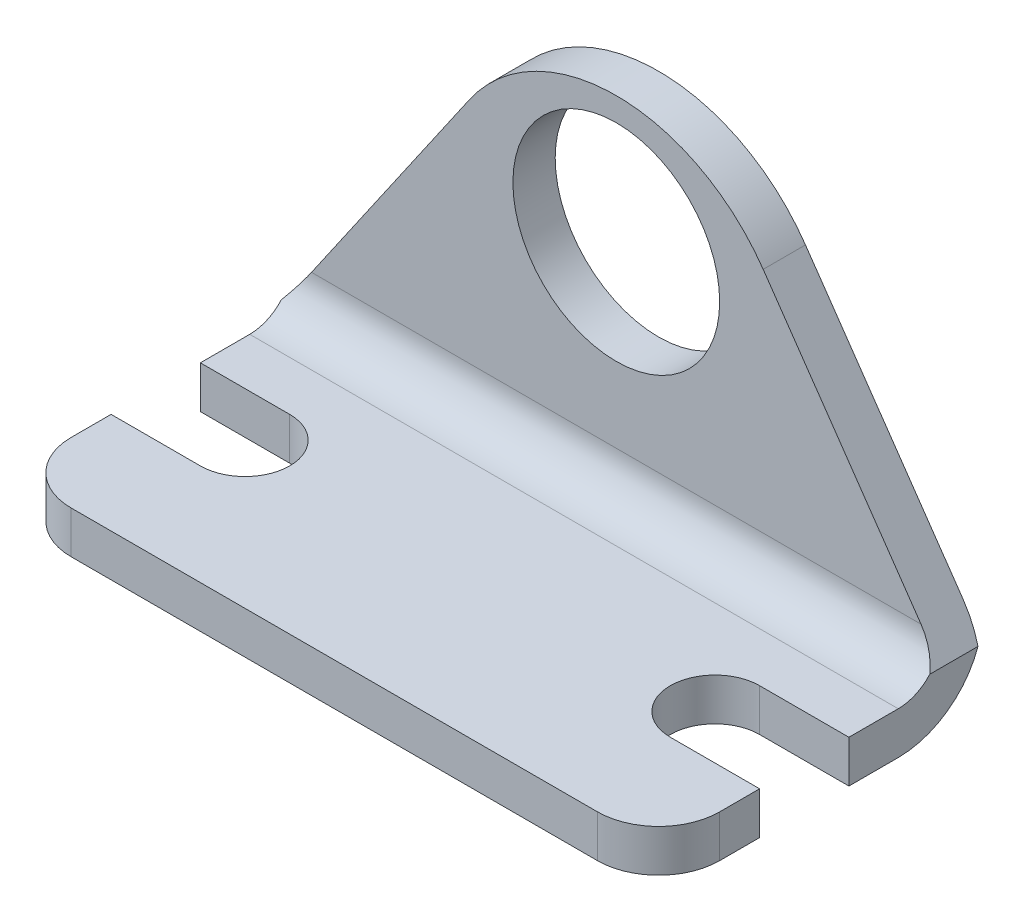
ISO-10303-21;
HEADER;
FILE_DESCRIPTION(('STEP AP214'),'2;1');
FILE_NAME('part.step','',(''),(''),'','','');
FILE_SCHEMA(('AUTOMOTIVE_DESIGN { 1 0 10303 214 1 1 1 1 }'));
ENDSEC;
DATA;
#1=APPLICATION_CONTEXT('core data for automotive mechanical design processes');
#2=APPLICATION_PROTOCOL_DEFINITION('international standard','automotive_design',2000,#1);
#3=PRODUCT_CONTEXT('',#1,'mechanical');
#4=PRODUCT('Part','Part','',(#3));
#5=PRODUCT_RELATED_PRODUCT_CATEGORY('part','',(#4));
#6=PRODUCT_DEFINITION_FORMATION('','',#4);
#7=PRODUCT_DEFINITION_CONTEXT('part definition',#1,'design');
#8=PRODUCT_DEFINITION('design','',#6,#7);
#9=PRODUCT_DEFINITION_SHAPE('','',#8);
#10=(LENGTH_UNIT() NAMED_UNIT(*) SI_UNIT(.MILLI.,.METRE.));
#11=(NAMED_UNIT(*) PLANE_ANGLE_UNIT() SI_UNIT($,.RADIAN.));
#12=(NAMED_UNIT(*) SI_UNIT($,.STERADIAN.) SOLID_ANGLE_UNIT());
#13=UNCERTAINTY_MEASURE_WITH_UNIT(LENGTH_MEASURE(1.E-05),#10,'distance_accuracy_value','');
#14=(GEOMETRIC_REPRESENTATION_CONTEXT(3) GLOBAL_UNCERTAINTY_ASSIGNED_CONTEXT((#13)) GLOBAL_UNIT_ASSIGNED_CONTEXT((#10,
#11,#12)) REPRESENTATION_CONTEXT('',''));
#15=CARTESIAN_POINT('',(0.,0.,0.));
#16=DIRECTION('',(0.,0.,1.));
#17=DIRECTION('',(1.,0.,0.));
#18=AXIS2_PLACEMENT_3D('',#15,#16,#17);
#19=CARTESIAN_POINT('',(0.,11.43,2.286));
#20=DIRECTION('',(0.,0.,1.));
#21=DIRECTION('',(1.,0.,0.));
#22=AXIS2_PLACEMENT_3D('',#19,#20,#21);
#23=PLANE('',#22);
#24=DIRECTION('',(-0.568557570936103,-0.822643475954948,0.));
#25=VECTOR('',#24,1.);
#26=CARTESIAN_POINT('',(-17.526,3.048,2.286));
#27=LINE('',#26,#25);
#28=CARTESIAN_POINT('',(-7.94015482991716,16.9177176746753,2.286));
#29=VERTEX_POINT('',#28);
#30=CARTESIAN_POINT('',(-16.4727104967911,4.572,2.286));
#31=VERTEX_POINT('',#30);
#32=EDGE_CURVE('E216',#29,#31,#27,.T.);
#33=ORIENTED_EDGE('',*,*,#32,.T.);
#34=DIRECTION('',(-1.,0.,0.));
#35=VECTOR('',#34,1.);
#36=CARTESIAN_POINT('',(17.526,4.572,2.286));
#37=LINE('',#36,#35);
#38=CARTESIAN_POINT('',(16.4727104967911,4.572,2.286));
#39=VERTEX_POINT('',#38);
#40=EDGE_CURVE('E239',#31,#39,#37,.F.);
#41=ORIENTED_EDGE('',*,*,#40,.T.);
#42=DIRECTION('',(-0.568557570936103,0.822643475954948,0.));
#43=VECTOR('',#42,1.);
#44=CARTESIAN_POINT('',(17.526,3.048,2.286));
#45=LINE('',#44,#43);
#46=CARTESIAN_POINT('',(7.94015482991716,16.9177176746753,2.286));
#47=VERTEX_POINT('',#46);
#48=EDGE_CURVE('E211',#39,#47,#45,.T.);
#49=ORIENTED_EDGE('',*,*,#48,.T.);
#50=CARTESIAN_POINT('',(0.,11.43,2.286));
#51=DIRECTION('',(0.,0.,1.));
#52=DIRECTION('',(1.,0.,0.));
#53=AXIS2_PLACEMENT_3D('',#50,#51,#52);
#54=CIRCLE('',#53,9.652);
#55=EDGE_CURVE('E213',#47,#29,#54,.T.);
#56=ORIENTED_EDGE('',*,*,#55,.T.);
#57=EDGE_LOOP('',(#33,#41,#49,#56));
#58=FACE_BOUND('',#57,.T.);
#59=CARTESIAN_POINT('',(0.,14.224,2.286));
#60=DIRECTION('',(0.,0.,1.));
#61=DIRECTION('',(1.,0.,0.));
#62=AXIS2_PLACEMENT_3D('',#59,#60,#61);
#63=CIRCLE('',#62,5.588);
#64=CARTESIAN_POINT('',(5.588,14.224,2.286));
#65=VERTEX_POINT('',#64);
#66=EDGE_CURVE('E202',#65,#65,#63,.T.);
#67=ORIENTED_EDGE('',*,*,#66,.F.);
#68=EDGE_LOOP('',(#67));
#69=FACE_BOUND('',#68,.T.);
#70=ADVANCED_FACE('F36',(#58,#69),#23,.T.);
#71=CARTESIAN_POINT('',(0.,11.43,0.));
#72=DIRECTION('',(0.,0.,1.));
#73=DIRECTION('',(1.,0.,0.));
#74=AXIS2_PLACEMENT_3D('',#71,#72,#73);
#75=PLANE('',#74);
#76=DIRECTION('',(-0.568557570936103,0.822643475954948,0.));
#77=VECTOR('',#76,1.);
#78=CARTESIAN_POINT('',(17.526,3.048,0.));
#79=LINE('',#78,#77);
#80=CARTESIAN_POINT('',(16.4727104967911,4.572,0.));
#81=VERTEX_POINT('',#80);
#82=CARTESIAN_POINT('',(7.94015482991716,16.9177176746753,0.));
#83=VERTEX_POINT('',#82);
#84=EDGE_CURVE('E209',#81,#83,#79,.T.);
#85=ORIENTED_EDGE('',*,*,#84,.F.);
#86=DIRECTION('',(1.,0.,0.));
#87=VECTOR('',#86,1.);
#88=CARTESIAN_POINT('',(0.,4.572,0.));
#89=LINE('',#88,#87);
#90=CARTESIAN_POINT('',(-16.4727104967911,4.572,0.));
#91=VERTEX_POINT('',#90);
#92=EDGE_CURVE('E58',#81,#91,#89,.F.);
#93=ORIENTED_EDGE('',*,*,#92,.T.);
#94=DIRECTION('',(-0.568557570936103,-0.822643475954948,0.));
#95=VECTOR('',#94,1.);
#96=CARTESIAN_POINT('',(-17.526,3.048,0.));
#97=LINE('',#96,#95);
#98=CARTESIAN_POINT('',(-7.94015482991716,16.9177176746753,0.));
#99=VERTEX_POINT('',#98);
#100=EDGE_CURVE('E214',#99,#91,#97,.T.);
#101=ORIENTED_EDGE('',*,*,#100,.F.);
#102=CARTESIAN_POINT('',(0.,11.43,0.));
#103=DIRECTION('',(0.,0.,1.));
#104=DIRECTION('',(1.,0.,0.));
#105=AXIS2_PLACEMENT_3D('',#102,#103,#104);
#106=CIRCLE('',#105,9.652);
#107=EDGE_CURVE('E221',#83,#99,#106,.T.);
#108=ORIENTED_EDGE('',*,*,#107,.F.);
#109=EDGE_LOOP('',(#85,#93,#101,#108));
#110=FACE_BOUND('',#109,.T.);
#111=CARTESIAN_POINT('',(0.,14.224,0.));
#112=DIRECTION('',(0.,0.,1.));
#113=DIRECTION('',(1.,0.,0.));
#114=AXIS2_PLACEMENT_3D('',#111,#112,#113);
#115=CIRCLE('',#114,5.588);
#116=CARTESIAN_POINT('',(5.588,14.224,0.));
#117=VERTEX_POINT('',#116);
#118=EDGE_CURVE('E199',#117,#117,#115,.T.);
#119=ORIENTED_EDGE('',*,*,#118,.T.);
#120=EDGE_LOOP('',(#119));
#121=FACE_BOUND('',#120,.T.);
#122=ADVANCED_FACE('F263',(#110,#121),#75,.F.);
#123=CARTESIAN_POINT('',(-17.526,0.,2.286));
#124=DIRECTION('',(1.,0.,0.));
#125=DIRECTION('',(0.,1.,0.));
#126=AXIS2_PLACEMENT_3D('',#123,#124,#125);
#127=PLANE('',#126);
#128=DIRECTION('',(0.,0.,-1.));
#129=VECTOR('',#128,1.);
#130=CARTESIAN_POINT('',(-17.526,3.048,2.286));
#131=LINE('',#130,#129);
#132=CARTESIAN_POINT('',(-17.526,3.048,2.86811620114516));
#133=VERTEX_POINT('',#132);
#134=CARTESIAN_POINT('',(-17.526,3.048,0.261477061886806));
#135=VERTEX_POINT('',#134);
#136=EDGE_CURVE('E219',#133,#135,#131,.T.);
#137=ORIENTED_EDGE('',*,*,#136,.T.);
#138=CARTESIAN_POINT('',(-17.526,4.572,4.572));
#139=DIRECTION('',(1.,0.,0.));
#140=DIRECTION('',(0.,1.,0.));
#141=AXIS2_PLACEMENT_3D('',#138,#139,#140);
#142=CIRCLE('',#141,4.572);
#143=CARTESIAN_POINT('',(-17.526,0.,4.572));
#144=VERTEX_POINT('',#143);
#145=EDGE_CURVE('E11',#135,#144,#142,.F.);
#146=ORIENTED_EDGE('',*,*,#145,.T.);
#147=DIRECTION('',(0.,0.,-1.));
#148=VECTOR('',#147,1.);
#149=CARTESIAN_POINT('',(-17.526,0.,2.286));
#150=LINE('',#149,#148);
#151=CARTESIAN_POINT('',(-17.526,0.,7.239));
#152=VERTEX_POINT('',#151);
#153=EDGE_CURVE('E197',#152,#144,#150,.T.);
#154=ORIENTED_EDGE('',*,*,#153,.F.);
#155=DIRECTION('',(0.,-1.,0.));
#156=VECTOR('',#155,1.);
#157=CARTESIAN_POINT('',(-17.526,2.286,7.239));
#158=LINE('',#157,#156);
#159=CARTESIAN_POINT('',(-17.526,2.286,7.239));
#160=VERTEX_POINT('',#159);
#161=EDGE_CURVE('E189',#160,#152,#158,.T.);
#162=ORIENTED_EDGE('',*,*,#161,.F.);
#163=DIRECTION('',(0.,0.,1.));
#164=VECTOR('',#163,1.);
#165=CARTESIAN_POINT('',(-17.526,2.286,0.));
#166=LINE('',#165,#164);
#167=CARTESIAN_POINT('',(-17.526,2.286,4.572));
#168=VERTEX_POINT('',#167);
#169=EDGE_CURVE('E173',#168,#160,#166,.T.);
#170=ORIENTED_EDGE('',*,*,#169,.F.);
#171=CARTESIAN_POINT('',(-17.526,4.572,4.572));
#172=DIRECTION('',(1.,0.,0.));
#173=DIRECTION('',(0.,1.,0.));
#174=AXIS2_PLACEMENT_3D('',#171,#172,#173);
#175=CIRCLE('',#174,2.286);
#176=EDGE_CURVE('E241',#168,#133,#175,.T.);
#177=ORIENTED_EDGE('',*,*,#176,.T.);
#178=EDGE_LOOP('',(#137,#146,#154,#162,#170,#177));
#179=FACE_BOUND('',#178,.T.);
#180=ADVANCED_FACE('F195',(#179),#127,.F.);
#181=CARTESIAN_POINT('',(-17.526,0.,2.286));
#182=DIRECTION('',(0.,1.,0.));
#183=DIRECTION('',(0.,0.,1.));
#184=AXIS2_PLACEMENT_3D('',#181,#182,#183);
#185=PLANE('',#184);
#186=ORIENTED_EDGE('',*,*,#153,.T.);
#187=DIRECTION('',(1.,0.,0.));
#188=VECTOR('',#187,1.);
#189=CARTESIAN_POINT('',(-17.526,0.,4.572));
#190=LINE('',#189,#188);
#191=CARTESIAN_POINT('',(17.526,0.,4.572));
#192=VERTEX_POINT('',#191);
#193=EDGE_CURVE('E250',#144,#192,#190,.T.);
#194=ORIENTED_EDGE('',*,*,#193,.T.);
#195=DIRECTION('',(0.,0.,-1.));
#196=VECTOR('',#195,1.);
#197=CARTESIAN_POINT('',(17.526,0.,2.286));
#198=LINE('',#197,#196);
#199=CARTESIAN_POINT('',(17.526,0.,7.239));
#200=VERTEX_POINT('',#199);
#201=EDGE_CURVE('E234',#200,#192,#198,.T.);
#202=ORIENTED_EDGE('',*,*,#201,.F.);
#203=DIRECTION('',(1.,0.,0.));
#204=VECTOR('',#203,1.);
#205=CARTESIAN_POINT('',(12.7,0.,7.23899999999999));
#206=LINE('',#205,#204);
#207=CARTESIAN_POINT('',(12.7,0.,7.23899999999999));
#208=VERTEX_POINT('',#207);
#209=EDGE_CURVE('E184',#208,#200,#206,.T.);
#210=ORIENTED_EDGE('',*,*,#209,.F.);
#211=CARTESIAN_POINT('',(12.7,0.,9.652));
#212=DIRECTION('',(0.,-1.,0.));
#213=DIRECTION('',(0.,0.,1.));
#214=AXIS2_PLACEMENT_3D('',#211,#212,#213);
#215=CIRCLE('',#214,2.413);
#216=CARTESIAN_POINT('',(12.7,0.,12.065));
#217=VERTEX_POINT('',#216);
#218=EDGE_CURVE('E293',#217,#208,#215,.T.);
#219=ORIENTED_EDGE('',*,*,#218,.F.);
#220=DIRECTION('',(-1.,0.,0.));
#221=VECTOR('',#220,1.);
#222=CARTESIAN_POINT('',(12.7,0.,12.065));
#223=LINE('',#222,#221);
#224=CARTESIAN_POINT('',(17.526,0.,12.065));
#225=VERTEX_POINT('',#224);
#226=EDGE_CURVE('E291',#225,#217,#223,.T.);
#227=ORIENTED_EDGE('',*,*,#226,.F.);
#228=DIRECTION('',(0.,0.,-1.));
#229=VECTOR('',#228,1.);
#230=CARTESIAN_POINT('',(17.526,0.,12.065));
#231=LINE('',#230,#229);
#232=CARTESIAN_POINT('',(17.526,0.,14.224));
#233=VERTEX_POINT('',#232);
#234=EDGE_CURVE('E289',#233,#225,#231,.T.);
#235=ORIENTED_EDGE('',*,*,#234,.F.);
#236=CARTESIAN_POINT('',(14.224,0.,14.224));
#237=DIRECTION('',(0.,1.,0.));
#238=DIRECTION('',(0.,0.,1.));
#239=AXIS2_PLACEMENT_3D('',#236,#237,#238);
#240=CIRCLE('',#239,3.302);
#241=CARTESIAN_POINT('',(14.224,0.,17.526));
#242=VERTEX_POINT('',#241);
#243=EDGE_CURVE('E287',#242,#233,#240,.T.);
#244=ORIENTED_EDGE('',*,*,#243,.F.);
#245=DIRECTION('',(1.,0.,0.));
#246=VECTOR('',#245,1.);
#247=CARTESIAN_POINT('',(-14.224,0.,17.526));
#248=LINE('',#247,#246);
#249=CARTESIAN_POINT('',(-14.224,0.,17.526));
#250=VERTEX_POINT('',#249);
#251=EDGE_CURVE('E285',#250,#242,#248,.T.);
#252=ORIENTED_EDGE('',*,*,#251,.F.);
#253=CARTESIAN_POINT('',(-14.224,0.,14.224));
#254=DIRECTION('',(0.,1.,0.));
#255=DIRECTION('',(0.,0.,1.));
#256=AXIS2_PLACEMENT_3D('',#253,#254,#255);
#257=CIRCLE('',#256,3.302);
#258=CARTESIAN_POINT('',(-17.526,0.,14.224));
#259=VERTEX_POINT('',#258);
#260=EDGE_CURVE('E283',#259,#250,#257,.T.);
#261=ORIENTED_EDGE('',*,*,#260,.F.);
#262=DIRECTION('',(0.,0.,1.));
#263=VECTOR('',#262,1.);
#264=CARTESIAN_POINT('',(-17.526,0.,12.065));
#265=LINE('',#264,#263);
#266=CARTESIAN_POINT('',(-17.526,0.,12.065));
#267=VERTEX_POINT('',#266);
#268=EDGE_CURVE('E281',#267,#259,#265,.T.);
#269=ORIENTED_EDGE('',*,*,#268,.F.);
#270=DIRECTION('',(-1.,0.,0.));
#271=VECTOR('',#270,1.);
#272=CARTESIAN_POINT('',(-12.7,0.,12.065));
#273=LINE('',#272,#271);
#274=CARTESIAN_POINT('',(-12.7,0.,12.065));
#275=VERTEX_POINT('',#274);
#276=EDGE_CURVE('E274',#275,#267,#273,.T.);
#277=ORIENTED_EDGE('',*,*,#276,.F.);
#278=CARTESIAN_POINT('',(-12.7,0.,9.652));
#279=DIRECTION('',(0.,-1.,0.));
#280=DIRECTION('',(0.,0.,1.));
#281=AXIS2_PLACEMENT_3D('',#278,#279,#280);
#282=CIRCLE('',#281,2.413);
#283=CARTESIAN_POINT('',(-12.7,0.,7.239));
#284=VERTEX_POINT('',#283);
#285=EDGE_CURVE('E272',#284,#275,#282,.T.);
#286=ORIENTED_EDGE('',*,*,#285,.F.);
#287=DIRECTION('',(1.,0.,0.));
#288=VECTOR('',#287,1.);
#289=CARTESIAN_POINT('',(-12.7,0.,7.239));
#290=LINE('',#289,#288);
#291=EDGE_CURVE('E270',#152,#284,#290,.T.);
#292=ORIENTED_EDGE('',*,*,#291,.F.);
#293=EDGE_LOOP('',(#186,#194,#202,#210,#219,#227,#235,#244,#252,#261,#269,#277,#286,#292));
#294=FACE_BOUND('',#293,.T.);
#295=ADVANCED_FACE('F268',(#294),#185,.F.);
#296=CARTESIAN_POINT('',(17.526,0.,2.286));
#297=DIRECTION('',(-1.,0.,0.));
#298=DIRECTION('',(0.,-1.,0.));
#299=AXIS2_PLACEMENT_3D('',#296,#297,#298);
#300=PLANE('',#299);
#301=ORIENTED_EDGE('',*,*,#201,.T.);
#302=CARTESIAN_POINT('',(17.526,4.572,4.572));
#303=DIRECTION('',(-1.,0.,0.));
#304=DIRECTION('',(0.,-1.,0.));
#305=AXIS2_PLACEMENT_3D('',#302,#303,#304);
#306=CIRCLE('',#305,4.572);
#307=CARTESIAN_POINT('',(17.526,3.048,0.261477061886804));
#308=VERTEX_POINT('',#307);
#309=EDGE_CURVE('E253',#192,#308,#306,.F.);
#310=ORIENTED_EDGE('',*,*,#309,.T.);
#311=DIRECTION('',(0.,0.,-1.));
#312=VECTOR('',#311,1.);
#313=CARTESIAN_POINT('',(17.526,3.048,2.286));
#314=LINE('',#313,#312);
#315=CARTESIAN_POINT('',(17.526,3.048,2.86811620114516));
#316=VERTEX_POINT('',#315);
#317=EDGE_CURVE('E231',#316,#308,#314,.T.);
#318=ORIENTED_EDGE('',*,*,#317,.F.);
#319=CARTESIAN_POINT('',(17.526,4.572,4.572));
#320=DIRECTION('',(-1.,0.,0.));
#321=DIRECTION('',(0.,-1.,0.));
#322=AXIS2_PLACEMENT_3D('',#319,#320,#321);
#323=CIRCLE('',#322,2.286);
#324=CARTESIAN_POINT('',(17.526,2.286,4.572));
#325=VERTEX_POINT('',#324);
#326=EDGE_CURVE('E248',#316,#325,#323,.T.);
#327=ORIENTED_EDGE('',*,*,#326,.T.);
#328=DIRECTION('',(0.,0.,-1.));
#329=VECTOR('',#328,1.);
#330=CARTESIAN_POINT('',(17.526,2.286,0.));
#331=LINE('',#330,#329);
#332=CARTESIAN_POINT('',(17.526,2.286,7.239));
#333=VERTEX_POINT('',#332);
#334=EDGE_CURVE('E277',#333,#325,#331,.T.);
#335=ORIENTED_EDGE('',*,*,#334,.F.);
#336=DIRECTION('',(0.,-1.,0.));
#337=VECTOR('',#336,1.);
#338=CARTESIAN_POINT('',(17.526,2.286,7.239));
#339=LINE('',#338,#337);
#340=EDGE_CURVE('E297',#333,#200,#339,.T.);
#341=ORIENTED_EDGE('',*,*,#340,.T.);
#342=EDGE_LOOP('',(#301,#310,#318,#327,#335,#341));
#343=FACE_BOUND('',#342,.T.);
#344=ADVANCED_FACE('F386',(#343),#300,.F.);
#345=CARTESIAN_POINT('',(17.526,3.048,2.286));
#346=DIRECTION('',(-0.822643475954948,-0.568557570936103,0.));
#347=DIRECTION('',(0.568557570936103,-0.822643475954948,0.));
#348=AXIS2_PLACEMENT_3D('',#345,#346,#347);
#349=PLANE('',#348);
#350=ORIENTED_EDGE('',*,*,#317,.T.);
#351=CARTESIAN_POINT('',(16.4727104967911,4.572,4.572));
#352=DIRECTION('',(-0.822643475954948,-0.568557570936103,0.));
#353=DIRECTION('',(0.568557570936103,-0.822643475954948,0.));
#354=AXIS2_PLACEMENT_3D('',#351,#352,#353);
#355=ELLIPSE('',#354,5.55769313637684,4.572);
#356=EDGE_CURVE('E255',#308,#81,#355,.F.);
#357=ORIENTED_EDGE('',*,*,#356,.T.);
#358=ORIENTED_EDGE('',*,*,#84,.T.);
#359=DIRECTION('',(0.,0.,-1.));
#360=VECTOR('',#359,1.);
#361=CARTESIAN_POINT('',(7.94015482991716,16.9177176746753,2.286));
#362=LINE('',#361,#360);
#363=EDGE_CURVE('E228',#47,#83,#362,.T.);
#364=ORIENTED_EDGE('',*,*,#363,.F.);
#365=ORIENTED_EDGE('',*,*,#48,.F.);
#366=CARTESIAN_POINT('',(16.4727104967911,4.572,4.572));
#367=DIRECTION('',(-0.822643475954948,-0.568557570936103,0.));
#368=DIRECTION('',(0.568557570936103,-0.822643475954948,0.));
#369=AXIS2_PLACEMENT_3D('',#366,#367,#368);
#370=ELLIPSE('',#369,2.77884656818842,2.286);
#371=EDGE_CURVE('E245',#39,#316,#370,.T.);
#372=ORIENTED_EDGE('',*,*,#371,.T.);
#373=EDGE_LOOP('',(#350,#357,#358,#364,#365,#372));
#374=FACE_BOUND('',#373,.T.);
#375=ADVANCED_FACE('F259',(#374),#349,.F.);
#376=CARTESIAN_POINT('',(0.,11.43,2.286));
#377=DIRECTION('',(0.,0.,-1.));
#378=DIRECTION('',(-1.,0.,0.));
#379=AXIS2_PLACEMENT_3D('',#376,#377,#378);
#380=CYLINDRICAL_SURFACE('',#379,9.652);
#381=ORIENTED_EDGE('',*,*,#107,.T.);
#382=DIRECTION('',(0.,0.,-1.));
#383=VECTOR('',#382,1.);
#384=CARTESIAN_POINT('',(-7.94015482991716,16.9177176746753,2.286));
#385=LINE('',#384,#383);
#386=EDGE_CURVE('E225',#29,#99,#385,.T.);
#387=ORIENTED_EDGE('',*,*,#386,.F.);
#388=ORIENTED_EDGE('',*,*,#55,.F.);
#389=ORIENTED_EDGE('',*,*,#363,.T.);
#390=EDGE_LOOP('',(#381,#387,#388,#389));
#391=FACE_BOUND('',#390,.T.);
#392=ADVANCED_FACE('F377',(#391),#380,.T.);
#393=CARTESIAN_POINT('',(-17.526,3.048,2.286));
#394=DIRECTION('',(0.822643475954948,-0.568557570936103,0.));
#395=DIRECTION('',(0.568557570936103,0.822643475954948,0.));
#396=AXIS2_PLACEMENT_3D('',#393,#394,#395);
#397=PLANE('',#396);
#398=ORIENTED_EDGE('',*,*,#100,.T.);
#399=CARTESIAN_POINT('',(-16.4727104967911,4.572,4.572));
#400=DIRECTION('',(0.822643475954948,-0.568557570936103,0.));
#401=DIRECTION('',(0.568557570936103,0.822643475954948,0.));
#402=AXIS2_PLACEMENT_3D('',#399,#400,#401);
#403=ELLIPSE('',#402,5.55769313637684,4.572);
#404=EDGE_CURVE('E44',#91,#135,#403,.F.);
#405=ORIENTED_EDGE('',*,*,#404,.T.);
#406=ORIENTED_EDGE('',*,*,#136,.F.);
#407=CARTESIAN_POINT('',(-16.4727104967911,4.572,4.572));
#408=DIRECTION('',(0.822643475954948,-0.568557570936103,0.));
#409=DIRECTION('',(0.568557570936103,0.822643475954948,0.));
#410=AXIS2_PLACEMENT_3D('',#407,#408,#409);
#411=ELLIPSE('',#410,2.77884656818842,2.286);
#412=EDGE_CURVE('E243',#133,#31,#411,.T.);
#413=ORIENTED_EDGE('',*,*,#412,.T.);
#414=ORIENTED_EDGE('',*,*,#32,.F.);
#415=ORIENTED_EDGE('',*,*,#386,.T.);
#416=EDGE_LOOP('',(#398,#405,#406,#413,#414,#415));
#417=FACE_BOUND('',#416,.T.);
#418=ADVANCED_FACE('F370',(#417),#397,.F.);
#419=CARTESIAN_POINT('',(0.,14.224,2.286));
#420=DIRECTION('',(0.,0.,-1.));
#421=DIRECTION('',(-1.,0.,0.));
#422=AXIS2_PLACEMENT_3D('',#419,#420,#421);
#423=CYLINDRICAL_SURFACE('',#422,5.588);
#424=ORIENTED_EDGE('',*,*,#66,.T.);
#425=EDGE_LOOP('',(#424));
#426=FACE_BOUND('',#425,.T.);
#427=ORIENTED_EDGE('',*,*,#118,.F.);
#428=EDGE_LOOP('',(#427));
#429=FACE_BOUND('',#428,.T.);
#430=ADVANCED_FACE('F384',(#426,#429),#423,.F.);
#431=CARTESIAN_POINT('',(-12.7,2.286,7.239));
#432=DIRECTION('',(0.,0.,-1.));
#433=DIRECTION('',(-1.,0.,0.));
#434=AXIS2_PLACEMENT_3D('',#431,#432,#433);
#435=PLANE('',#434);
#436=ORIENTED_EDGE('',*,*,#291,.T.);
#437=DIRECTION('',(0.,-1.,0.));
#438=VECTOR('',#437,1.);
#439=CARTESIAN_POINT('',(-12.7,2.286,7.239));
#440=LINE('',#439,#438);
#441=CARTESIAN_POINT('',(-12.7,2.286,7.239));
#442=VERTEX_POINT('',#441);
#443=EDGE_CURVE('E191',#442,#284,#440,.T.);
#444=ORIENTED_EDGE('',*,*,#443,.F.);
#445=DIRECTION('',(1.,0.,0.));
#446=VECTOR('',#445,1.);
#447=CARTESIAN_POINT('',(-12.7,2.286,7.239));
#448=LINE('',#447,#446);
#449=EDGE_CURVE('E177',#160,#442,#448,.T.);
#450=ORIENTED_EDGE('',*,*,#449,.F.);
#451=ORIENTED_EDGE('',*,*,#161,.T.);
#452=EDGE_LOOP('',(#436,#444,#450,#451));
#453=FACE_BOUND('',#452,.T.);
#454=ADVANCED_FACE('F188',(#453),#435,.F.);
#455=CARTESIAN_POINT('',(-12.7,2.286,9.652));
#456=DIRECTION('',(0.,-1.,0.));
#457=DIRECTION('',(0.,0.,-1.));
#458=AXIS2_PLACEMENT_3D('',#455,#456,#457);
#459=CYLINDRICAL_SURFACE('',#458,2.413);
#460=ORIENTED_EDGE('',*,*,#285,.T.);
#461=DIRECTION('',(0.,-1.,0.));
#462=VECTOR('',#461,1.);
#463=CARTESIAN_POINT('',(-12.7,2.286,12.065));
#464=LINE('',#463,#462);
#465=CARTESIAN_POINT('',(-12.7,2.286,12.065));
#466=VERTEX_POINT('',#465);
#467=EDGE_CURVE('E204',#466,#275,#464,.T.);
#468=ORIENTED_EDGE('',*,*,#467,.F.);
#469=CARTESIAN_POINT('',(-12.7,2.286,9.652));
#470=DIRECTION('',(0.,-1.,0.));
#471=DIRECTION('',(0.,0.,1.));
#472=AXIS2_PLACEMENT_3D('',#469,#470,#471);
#473=CIRCLE('',#472,2.413);
#474=EDGE_CURVE('E193',#442,#466,#473,.T.);
#475=ORIENTED_EDGE('',*,*,#474,.F.);
#476=ORIENTED_EDGE('',*,*,#443,.T.);
#477=EDGE_LOOP('',(#460,#468,#475,#476));
#478=FACE_BOUND('',#477,.T.);
#479=ADVANCED_FACE('F400',(#478),#459,.F.);
#480=CARTESIAN_POINT('',(-12.7,2.286,12.065));
#481=DIRECTION('',(0.,0.,1.));
#482=DIRECTION('',(1.,0.,0.));
#483=AXIS2_PLACEMENT_3D('',#480,#481,#482);
#484=PLANE('',#483);
#485=ORIENTED_EDGE('',*,*,#276,.T.);
#486=DIRECTION('',(0.,-1.,0.));
#487=VECTOR('',#486,1.);
#488=CARTESIAN_POINT('',(-17.526,2.286,12.065));
#489=LINE('',#488,#487);
#490=CARTESIAN_POINT('',(-17.526,2.286,12.065));
#491=VERTEX_POINT('',#490);
#492=EDGE_CURVE('E321',#491,#267,#489,.T.);
#493=ORIENTED_EDGE('',*,*,#492,.F.);
#494=DIRECTION('',(-1.,0.,0.));
#495=VECTOR('',#494,1.);
#496=CARTESIAN_POINT('',(-12.7,2.286,12.065));
#497=LINE('',#496,#495);
#498=EDGE_CURVE('E329',#466,#491,#497,.T.);
#499=ORIENTED_EDGE('',*,*,#498,.F.);
#500=ORIENTED_EDGE('',*,*,#467,.T.);
#501=EDGE_LOOP('',(#485,#493,#499,#500));
#502=FACE_BOUND('',#501,.T.);
#503=ADVANCED_FACE('F327',(#502),#484,.F.);
#504=CARTESIAN_POINT('',(-17.526,2.286,12.065));
#505=DIRECTION('',(1.,0.,0.));
#506=DIRECTION('',(0.,0.,-1.));
#507=AXIS2_PLACEMENT_3D('',#504,#505,#506);
#508=PLANE('',#507);
#509=ORIENTED_EDGE('',*,*,#268,.T.);
#510=DIRECTION('',(0.,-1.,0.));
#511=VECTOR('',#510,1.);
#512=CARTESIAN_POINT('',(-17.526,2.286,14.224));
#513=LINE('',#512,#511);
#514=CARTESIAN_POINT('',(-17.526,2.286,14.224));
#515=VERTEX_POINT('',#514);
#516=EDGE_CURVE('E318',#515,#259,#513,.T.);
#517=ORIENTED_EDGE('',*,*,#516,.F.);
#518=DIRECTION('',(0.,0.,1.));
#519=VECTOR('',#518,1.);
#520=CARTESIAN_POINT('',(-17.526,2.286,12.065));
#521=LINE('',#520,#519);
#522=EDGE_CURVE('E345',#491,#515,#521,.T.);
#523=ORIENTED_EDGE('',*,*,#522,.F.);
#524=ORIENTED_EDGE('',*,*,#492,.T.);
#525=EDGE_LOOP('',(#509,#517,#523,#524));
#526=FACE_BOUND('',#525,.T.);
#527=ADVANCED_FACE('F336',(#526),#508,.F.);
#528=CARTESIAN_POINT('',(-14.224,2.286,14.224));
#529=DIRECTION('',(0.,-1.,0.));
#530=DIRECTION('',(0.,0.,-1.));
#531=AXIS2_PLACEMENT_3D('',#528,#529,#530);
#532=CYLINDRICAL_SURFACE('',#531,3.302);
#533=ORIENTED_EDGE('',*,*,#260,.T.);
#534=DIRECTION('',(0.,-1.,0.));
#535=VECTOR('',#534,1.);
#536=CARTESIAN_POINT('',(-14.224,2.286,17.526));
#537=LINE('',#536,#535);
#538=CARTESIAN_POINT('',(-14.224,2.286,17.526));
#539=VERTEX_POINT('',#538);
#540=EDGE_CURVE('E315',#539,#250,#537,.T.);
#541=ORIENTED_EDGE('',*,*,#540,.F.);
#542=CARTESIAN_POINT('',(-14.224,2.286,14.224));
#543=DIRECTION('',(0.,1.,0.));
#544=DIRECTION('',(0.,0.,1.));
#545=AXIS2_PLACEMENT_3D('',#542,#543,#544);
#546=CIRCLE('',#545,3.302);
#547=EDGE_CURVE('E342',#515,#539,#546,.T.);
#548=ORIENTED_EDGE('',*,*,#547,.F.);
#549=ORIENTED_EDGE('',*,*,#516,.T.);
#550=EDGE_LOOP('',(#533,#541,#548,#549));
#551=FACE_BOUND('',#550,.T.);
#552=ADVANCED_FACE('F340',(#551),#532,.T.);
#553=CARTESIAN_POINT('',(-14.224,2.286,17.526));
#554=DIRECTION('',(0.,0.,-1.));
#555=DIRECTION('',(-1.,0.,0.));
#556=AXIS2_PLACEMENT_3D('',#553,#554,#555);
#557=PLANE('',#556);
#558=ORIENTED_EDGE('',*,*,#251,.T.);
#559=DIRECTION('',(0.,-1.,0.));
#560=VECTOR('',#559,1.);
#561=CARTESIAN_POINT('',(14.224,2.286,17.526));
#562=LINE('',#561,#560);
#563=CARTESIAN_POINT('',(14.224,2.286,17.526));
#564=VERTEX_POINT('',#563);
#565=EDGE_CURVE('E312',#564,#242,#562,.T.);
#566=ORIENTED_EDGE('',*,*,#565,.F.);
#567=DIRECTION('',(1.,0.,0.));
#568=VECTOR('',#567,1.);
#569=CARTESIAN_POINT('',(-14.224,2.286,17.526));
#570=LINE('',#569,#568);
#571=EDGE_CURVE('E344',#539,#564,#570,.T.);
#572=ORIENTED_EDGE('',*,*,#571,.F.);
#573=ORIENTED_EDGE('',*,*,#540,.T.);
#574=EDGE_LOOP('',(#558,#566,#572,#573));
#575=FACE_BOUND('',#574,.T.);
#576=ADVANCED_FACE('F409',(#575),#557,.F.);
#577=CARTESIAN_POINT('',(14.224,2.286,14.224));
#578=DIRECTION('',(0.,-1.,0.));
#579=DIRECTION('',(0.,0.,-1.));
#580=AXIS2_PLACEMENT_3D('',#577,#578,#579);
#581=CYLINDRICAL_SURFACE('',#580,3.302);
#582=ORIENTED_EDGE('',*,*,#243,.T.);
#583=DIRECTION('',(0.,-1.,0.));
#584=VECTOR('',#583,1.);
#585=CARTESIAN_POINT('',(17.526,2.286,14.224));
#586=LINE('',#585,#584);
#587=CARTESIAN_POINT('',(17.526,2.286,14.224));
#588=VERTEX_POINT('',#587);
#589=EDGE_CURVE('E309',#588,#233,#586,.T.);
#590=ORIENTED_EDGE('',*,*,#589,.F.);
#591=CARTESIAN_POINT('',(14.224,2.286,14.224));
#592=DIRECTION('',(0.,1.,0.));
#593=DIRECTION('',(0.,0.,1.));
#594=AXIS2_PLACEMENT_3D('',#591,#592,#593);
#595=CIRCLE('',#594,3.302);
#596=EDGE_CURVE('E347',#564,#588,#595,.T.);
#597=ORIENTED_EDGE('',*,*,#596,.F.);
#598=ORIENTED_EDGE('',*,*,#565,.T.);
#599=EDGE_LOOP('',(#582,#590,#597,#598));
#600=FACE_BOUND('',#599,.T.);
#601=ADVANCED_FACE('F412',(#600),#581,.T.);
#602=CARTESIAN_POINT('',(17.526,2.286,12.065));
#603=DIRECTION('',(-1.,0.,0.));
#604=DIRECTION('',(0.,0.,1.));
#605=AXIS2_PLACEMENT_3D('',#602,#603,#604);
#606=PLANE('',#605);
#607=ORIENTED_EDGE('',*,*,#234,.T.);
#608=DIRECTION('',(0.,-1.,0.));
#609=VECTOR('',#608,1.);
#610=CARTESIAN_POINT('',(17.526,2.286,12.065));
#611=LINE('',#610,#609);
#612=CARTESIAN_POINT('',(17.526,2.286,12.065));
#613=VERTEX_POINT('',#612);
#614=EDGE_CURVE('E306',#613,#225,#611,.T.);
#615=ORIENTED_EDGE('',*,*,#614,.F.);
#616=DIRECTION('',(0.,0.,-1.));
#617=VECTOR('',#616,1.);
#618=CARTESIAN_POINT('',(17.526,2.286,12.065));
#619=LINE('',#618,#617);
#620=EDGE_CURVE('E353',#588,#613,#619,.T.);
#621=ORIENTED_EDGE('',*,*,#620,.F.);
#622=ORIENTED_EDGE('',*,*,#589,.T.);
#623=EDGE_LOOP('',(#607,#615,#621,#622));
#624=FACE_BOUND('',#623,.T.);
#625=ADVANCED_FACE('F416',(#624),#606,.F.);
#626=CARTESIAN_POINT('',(12.7,2.286,12.065));
#627=DIRECTION('',(0.,0.,1.));
#628=DIRECTION('',(1.,0.,0.));
#629=AXIS2_PLACEMENT_3D('',#626,#627,#628);
#630=PLANE('',#629);
#631=ORIENTED_EDGE('',*,*,#226,.T.);
#632=DIRECTION('',(0.,-1.,0.));
#633=VECTOR('',#632,1.);
#634=CARTESIAN_POINT('',(12.7,2.286,12.065));
#635=LINE('',#634,#633);
#636=CARTESIAN_POINT('',(12.7,2.286,12.065));
#637=VERTEX_POINT('',#636);
#638=EDGE_CURVE('E303',#637,#217,#635,.T.);
#639=ORIENTED_EDGE('',*,*,#638,.F.);
#640=DIRECTION('',(-1.,0.,0.));
#641=VECTOR('',#640,1.);
#642=CARTESIAN_POINT('',(12.7,2.286,12.065));
#643=LINE('',#642,#641);
#644=EDGE_CURVE('E355',#613,#637,#643,.T.);
#645=ORIENTED_EDGE('',*,*,#644,.F.);
#646=ORIENTED_EDGE('',*,*,#614,.T.);
#647=EDGE_LOOP('',(#631,#639,#645,#646));
#648=FACE_BOUND('',#647,.T.);
#649=ADVANCED_FACE('F420',(#648),#630,.F.);
#650=CARTESIAN_POINT('',(12.7,2.286,9.652));
#651=DIRECTION('',(0.,-1.,0.));
#652=DIRECTION('',(0.,0.,-1.));
#653=AXIS2_PLACEMENT_3D('',#650,#651,#652);
#654=CYLINDRICAL_SURFACE('',#653,2.413);
#655=ORIENTED_EDGE('',*,*,#218,.T.);
#656=DIRECTION('',(0.,-1.,0.));
#657=VECTOR('',#656,1.);
#658=CARTESIAN_POINT('',(12.7,2.286,7.23899999999999));
#659=LINE('',#658,#657);
#660=CARTESIAN_POINT('',(12.7,2.286,7.23899999999999));
#661=VERTEX_POINT('',#660);
#662=EDGE_CURVE('E300',#661,#208,#659,.T.);
#663=ORIENTED_EDGE('',*,*,#662,.F.);
#664=CARTESIAN_POINT('',(12.7,2.286,9.652));
#665=DIRECTION('',(0.,-1.,0.));
#666=DIRECTION('',(0.,0.,1.));
#667=AXIS2_PLACEMENT_3D('',#664,#665,#666);
#668=CIRCLE('',#667,2.413);
#669=EDGE_CURVE('E357',#637,#661,#668,.T.);
#670=ORIENTED_EDGE('',*,*,#669,.F.);
#671=ORIENTED_EDGE('',*,*,#638,.T.);
#672=EDGE_LOOP('',(#655,#663,#670,#671));
#673=FACE_BOUND('',#672,.T.);
#674=ADVANCED_FACE('F424',(#673),#654,.F.);
#675=CARTESIAN_POINT('',(12.7,2.286,7.23899999999999));
#676=DIRECTION('',(0.,0.,-1.));
#677=DIRECTION('',(-1.,0.,0.));
#678=AXIS2_PLACEMENT_3D('',#675,#676,#677);
#679=PLANE('',#678);
#680=ORIENTED_EDGE('',*,*,#209,.T.);
#681=ORIENTED_EDGE('',*,*,#340,.F.);
#682=DIRECTION('',(1.,0.,0.));
#683=VECTOR('',#682,1.);
#684=CARTESIAN_POINT('',(12.7,2.286,7.23899999999999));
#685=LINE('',#684,#683);
#686=EDGE_CURVE('E358',#661,#333,#685,.T.);
#687=ORIENTED_EDGE('',*,*,#686,.F.);
#688=ORIENTED_EDGE('',*,*,#662,.T.);
#689=EDGE_LOOP('',(#680,#681,#687,#688));
#690=FACE_BOUND('',#689,.T.);
#691=ADVANCED_FACE('F428',(#690),#679,.F.);
#692=CARTESIAN_POINT('',(-12.7,2.286,9.652));
#693=DIRECTION('',(0.,1.,0.));
#694=DIRECTION('',(0.,0.,1.));
#695=AXIS2_PLACEMENT_3D('',#692,#693,#694);
#696=PLANE('',#695);
#697=ORIENTED_EDGE('',*,*,#334,.T.);
#698=DIRECTION('',(-1.,0.,0.));
#699=VECTOR('',#698,1.);
#700=CARTESIAN_POINT('',(-17.526,2.286,4.572));
#701=LINE('',#700,#699);
#702=EDGE_CURVE('E180',#325,#168,#701,.T.);
#703=ORIENTED_EDGE('',*,*,#702,.T.);
#704=ORIENTED_EDGE('',*,*,#169,.T.);
#705=ORIENTED_EDGE('',*,*,#449,.T.);
#706=ORIENTED_EDGE('',*,*,#474,.T.);
#707=ORIENTED_EDGE('',*,*,#498,.T.);
#708=ORIENTED_EDGE('',*,*,#522,.T.);
#709=ORIENTED_EDGE('',*,*,#547,.T.);
#710=ORIENTED_EDGE('',*,*,#571,.T.);
#711=ORIENTED_EDGE('',*,*,#596,.T.);
#712=ORIENTED_EDGE('',*,*,#620,.T.);
#713=ORIENTED_EDGE('',*,*,#644,.T.);
#714=ORIENTED_EDGE('',*,*,#669,.T.);
#715=ORIENTED_EDGE('',*,*,#686,.T.);
#716=EDGE_LOOP('',(#697,#703,#704,#705,#706,#707,#708,#709,#710,#711,#712,#713,#714,#715));
#717=FACE_BOUND('',#716,.T.);
#718=ADVANCED_FACE('F176',(#717),#696,.T.);
#719=CARTESIAN_POINT('',(-12.7,4.572,4.572));
#720=DIRECTION('',(1.,0.,0.));
#721=DIRECTION('',(0.,0.,-1.));
#722=AXIS2_PLACEMENT_3D('',#719,#720,#721);
#723=CYLINDRICAL_SURFACE('',#722,2.286);
#724=ORIENTED_EDGE('',*,*,#371,.F.);
#725=ORIENTED_EDGE('',*,*,#40,.F.);
#726=ORIENTED_EDGE('',*,*,#412,.F.);
#727=ORIENTED_EDGE('',*,*,#176,.F.);
#728=ORIENTED_EDGE('',*,*,#702,.F.);
#729=ORIENTED_EDGE('',*,*,#326,.F.);
#730=EDGE_LOOP('',(#724,#725,#726,#727,#728,#729));
#731=FACE_BOUND('',#730,.T.);
#732=ADVANCED_FACE('F366',(#731),#723,.F.);
#733=CARTESIAN_POINT('',(-17.526,4.572,4.572));
#734=DIRECTION('',(1.,0.,0.));
#735=DIRECTION('',(0.,0.,-1.));
#736=AXIS2_PLACEMENT_3D('',#733,#734,#735);
#737=CYLINDRICAL_SURFACE('',#736,4.572);
#738=ORIENTED_EDGE('',*,*,#404,.F.);
#739=ORIENTED_EDGE('',*,*,#92,.F.);
#740=ORIENTED_EDGE('',*,*,#356,.F.);
#741=ORIENTED_EDGE('',*,*,#309,.F.);
#742=ORIENTED_EDGE('',*,*,#193,.F.);
#743=ORIENTED_EDGE('',*,*,#145,.F.);
#744=EDGE_LOOP('',(#738,#739,#740,#741,#742,#743));
#745=FACE_BOUND('',#744,.T.);
#746=ADVANCED_FACE('F38',(#745),#737,.T.);
#747=CLOSED_SHELL('',(#70,#122,#180,#295,#344,#375,#392,#418,#430,#454,#479,#503,#527,#552,#576,
#601,#625,#649,#674,#691,#718,#732,#746));
#748=MANIFOLD_SOLID_BREP('B2',#747);
#749=ADVANCED_BREP_SHAPE_REPRESENTATION('',(#18,#748),#14);
#750=SHAPE_DEFINITION_REPRESENTATION(#9,#749);
ENDSEC;
END-ISO-10303-21;
